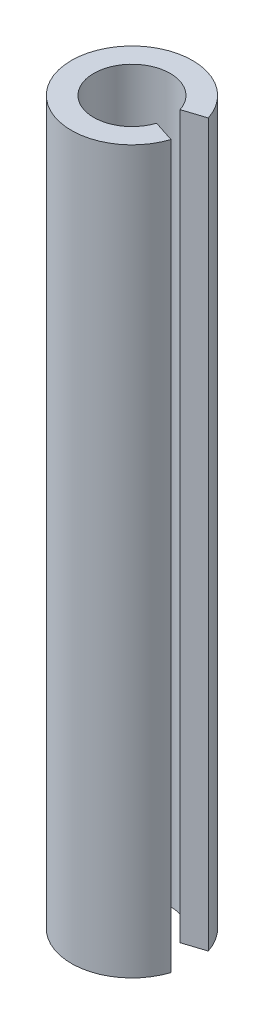
ISO-10303-21;
HEADER;
FILE_DESCRIPTION(('STEP AP214'),'2;1');
FILE_NAME('part.step','',(''),(''),'','','');
FILE_SCHEMA(('AUTOMOTIVE_DESIGN { 1 0 10303 214 1 1 1 1 }'));
ENDSEC;
DATA;
#1=APPLICATION_CONTEXT('core data for automotive mechanical design processes');
#2=APPLICATION_PROTOCOL_DEFINITION('international standard','automotive_design',2000,#1);
#3=PRODUCT_CONTEXT('',#1,'mechanical');
#4=PRODUCT('Part','Part','',(#3));
#5=PRODUCT_RELATED_PRODUCT_CATEGORY('part','',(#4));
#6=PRODUCT_DEFINITION_FORMATION('','',#4);
#7=PRODUCT_DEFINITION_CONTEXT('part definition',#1,'design');
#8=PRODUCT_DEFINITION('design','',#6,#7);
#9=PRODUCT_DEFINITION_SHAPE('','',#8);
#10=(LENGTH_UNIT() NAMED_UNIT(*) SI_UNIT(.MILLI.,.METRE.));
#11=(NAMED_UNIT(*) PLANE_ANGLE_UNIT() SI_UNIT($,.RADIAN.));
#12=(NAMED_UNIT(*) SI_UNIT($,.STERADIAN.) SOLID_ANGLE_UNIT());
#13=UNCERTAINTY_MEASURE_WITH_UNIT(LENGTH_MEASURE(1.E-05),#10,'distance_accuracy_value','');
#14=(GEOMETRIC_REPRESENTATION_CONTEXT(3) GLOBAL_UNCERTAINTY_ASSIGNED_CONTEXT((#13)) GLOBAL_UNIT_ASSIGNED_CONTEXT((#10,
#11,#12)) REPRESENTATION_CONTEXT('',''));
#15=CARTESIAN_POINT('',(0.,0.,0.));
#16=DIRECTION('',(0.,0.,1.));
#17=DIRECTION('',(1.,0.,0.));
#18=AXIS2_PLACEMENT_3D('',#15,#16,#17);
#19=CARTESIAN_POINT('',(0.,38.7,0.));
#20=DIRECTION('',(0.,-1.,0.));
#21=DIRECTION('',(0.,0.,-1.));
#22=AXIS2_PLACEMENT_3D('',#19,#20,#21);
#23=CYLINDRICAL_SURFACE('',#22,3.25);
#24=CARTESIAN_POINT('',(0.,0.,0.));
#25=DIRECTION('',(0.,1.,0.));
#26=DIRECTION('',(0.,0.,1.));
#27=AXIS2_PLACEMENT_3D('',#24,#25,#26);
#28=CIRCLE('',#27,3.25);
#29=CARTESIAN_POINT('',(3.09232921921324,0.,-1.));
#30=VERTEX_POINT('',#29);
#31=CARTESIAN_POINT('',(3.09232921921325,0.,0.999999999999999));
#32=VERTEX_POINT('',#31);
#33=EDGE_CURVE('E112',#30,#32,#28,.T.);
#34=ORIENTED_EDGE('',*,*,#33,.T.);
#35=DIRECTION('',(0.,-1.,0.));
#36=VECTOR('',#35,1.);
#37=CARTESIAN_POINT('',(3.09232921921325,38.7,0.999999999999999));
#38=LINE('',#37,#36);
#39=CARTESIAN_POINT('',(3.09232921921325,38.7,0.999999999999999));
#40=VERTEX_POINT('',#39);
#41=EDGE_CURVE('E13',#40,#32,#38,.T.);
#42=ORIENTED_EDGE('',*,*,#41,.F.);
#43=CARTESIAN_POINT('',(0.,38.7,0.));
#44=DIRECTION('',(0.,1.,0.));
#45=DIRECTION('',(0.,0.,1.));
#46=AXIS2_PLACEMENT_3D('',#43,#44,#45);
#47=CIRCLE('',#46,3.25);
#48=CARTESIAN_POINT('',(3.09232921921324,38.7,-1.));
#49=VERTEX_POINT('',#48);
#50=EDGE_CURVE('E89',#49,#40,#47,.T.);
#51=ORIENTED_EDGE('',*,*,#50,.F.);
#52=DIRECTION('',(0.,-1.,0.));
#53=VECTOR('',#52,1.);
#54=CARTESIAN_POINT('',(3.09232921921324,38.7,-1.));
#55=LINE('',#54,#53);
#56=EDGE_CURVE('E65',#49,#30,#55,.T.);
#57=ORIENTED_EDGE('',*,*,#56,.T.);
#58=EDGE_LOOP('',(#34,#42,#51,#57));
#59=FACE_BOUND('',#58,.T.);
#60=ADVANCED_FACE('F49',(#59),#23,.T.);
#61=CARTESIAN_POINT('',(1.95054612288835,38.7,0.630769230769231));
#62=DIRECTION('',(0.307692307692307,0.,-0.951485913604076));
#63=DIRECTION('',(-0.951485913604076,0.,-0.307692307692307));
#64=AXIS2_PLACEMENT_3D('',#61,#62,#63);
#65=PLANE('',#64);
#66=DIRECTION('',(0.951485913604076,0.,0.307692307692307));
#67=VECTOR('',#66,1.);
#68=CARTESIAN_POINT('',(1.95054612288835,0.,0.630769230769231));
#69=LINE('',#68,#67);
#70=CARTESIAN_POINT('',(1.95054612288835,0.,0.630769230769231));
#71=VERTEX_POINT('',#70);
#72=EDGE_CURVE('E98',#71,#32,#69,.T.);
#73=ORIENTED_EDGE('',*,*,#72,.F.);
#74=DIRECTION('',(0.,-1.,0.));
#75=VECTOR('',#74,1.);
#76=CARTESIAN_POINT('',(1.95054612288835,38.7,0.630769230769231));
#77=LINE('',#76,#75);
#78=CARTESIAN_POINT('',(1.95054612288835,38.7,0.630769230769231));
#79=VERTEX_POINT('',#78);
#80=EDGE_CURVE('E57',#79,#71,#77,.T.);
#81=ORIENTED_EDGE('',*,*,#80,.F.);
#82=DIRECTION('',(0.951485913604076,0.,0.307692307692307));
#83=VECTOR('',#82,1.);
#84=CARTESIAN_POINT('',(1.95054612288835,38.7,0.630769230769231));
#85=LINE('',#84,#83);
#86=EDGE_CURVE('E96',#79,#40,#85,.T.);
#87=ORIENTED_EDGE('',*,*,#86,.T.);
#88=ORIENTED_EDGE('',*,*,#41,.T.);
#89=EDGE_LOOP('',(#73,#81,#87,#88));
#90=FACE_BOUND('',#89,.T.);
#91=ADVANCED_FACE('F95',(#90),#65,.T.);
#92=CARTESIAN_POINT('',(0.,38.7,0.));
#93=DIRECTION('',(0.,-1.,0.));
#94=DIRECTION('',(0.,0.,-1.));
#95=AXIS2_PLACEMENT_3D('',#92,#93,#94);
#96=CYLINDRICAL_SURFACE('',#95,2.05);
#97=CARTESIAN_POINT('',(0.,0.,0.));
#98=DIRECTION('',(0.,1.,0.));
#99=DIRECTION('',(1.,0.,0.));
#100=AXIS2_PLACEMENT_3D('',#97,#98,#99);
#101=CIRCLE('',#100,2.05);
#102=CARTESIAN_POINT('',(1.95054612288835,0.,-0.630769230769231));
#103=VERTEX_POINT('',#102);
#104=EDGE_CURVE('E115',#103,#71,#101,.T.);
#105=ORIENTED_EDGE('',*,*,#104,.F.);
#106=DIRECTION('',(0.,-1.,0.));
#107=VECTOR('',#106,1.);
#108=CARTESIAN_POINT('',(1.95054612288835,38.7,-0.630769230769231));
#109=LINE('',#108,#107);
#110=CARTESIAN_POINT('',(1.95054612288835,38.7,-0.630769230769231));
#111=VERTEX_POINT('',#110);
#112=EDGE_CURVE('E78',#111,#103,#109,.T.);
#113=ORIENTED_EDGE('',*,*,#112,.F.);
#114=CARTESIAN_POINT('',(0.,38.7,0.));
#115=DIRECTION('',(0.,1.,0.));
#116=DIRECTION('',(1.,0.,0.));
#117=AXIS2_PLACEMENT_3D('',#114,#115,#116);
#118=CIRCLE('',#117,2.05);
#119=EDGE_CURVE('E104',#111,#79,#118,.T.);
#120=ORIENTED_EDGE('',*,*,#119,.T.);
#121=ORIENTED_EDGE('',*,*,#80,.T.);
#122=EDGE_LOOP('',(#105,#113,#120,#121));
#123=FACE_BOUND('',#122,.T.);
#124=ADVANCED_FACE('F106',(#123),#96,.F.);
#125=CARTESIAN_POINT('',(3.09232921921324,38.7,-1.));
#126=DIRECTION('',(0.307692307692308,0.,0.951485913604076));
#127=DIRECTION('',(0.951485913604076,0.,-0.307692307692308));
#128=AXIS2_PLACEMENT_3D('',#125,#126,#127);
#129=PLANE('',#128);
#130=DIRECTION('',(-0.951485913604076,0.,0.307692307692308));
#131=VECTOR('',#130,1.);
#132=CARTESIAN_POINT('',(3.09232921921324,0.,-1.));
#133=LINE('',#132,#131);
#134=EDGE_CURVE('E117',#30,#103,#133,.T.);
#135=ORIENTED_EDGE('',*,*,#134,.F.);
#136=ORIENTED_EDGE('',*,*,#56,.F.);
#137=DIRECTION('',(-0.951485913604076,0.,0.307692307692308));
#138=VECTOR('',#137,1.);
#139=CARTESIAN_POINT('',(3.09232921921324,38.7,-1.));
#140=LINE('',#139,#138);
#141=EDGE_CURVE('E107',#49,#111,#140,.T.);
#142=ORIENTED_EDGE('',*,*,#141,.T.);
#143=ORIENTED_EDGE('',*,*,#112,.T.);
#144=EDGE_LOOP('',(#135,#136,#142,#143));
#145=FACE_BOUND('',#144,.T.);
#146=ADVANCED_FACE('F123',(#145),#129,.T.);
#147=CARTESIAN_POINT('',(0.,38.7,0.));
#148=DIRECTION('',(0.,1.,0.));
#149=DIRECTION('',(1.,0.,0.));
#150=AXIS2_PLACEMENT_3D('',#147,#148,#149);
#151=PLANE('',#150);
#152=ORIENTED_EDGE('',*,*,#50,.T.);
#153=ORIENTED_EDGE('',*,*,#86,.F.);
#154=ORIENTED_EDGE('',*,*,#119,.F.);
#155=ORIENTED_EDGE('',*,*,#141,.F.);
#156=EDGE_LOOP('',(#152,#153,#154,#155));
#157=FACE_BOUND('',#156,.T.);
#158=ADVANCED_FACE('F103',(#157),#151,.T.);
#159=CARTESIAN_POINT('',(0.,0.,0.));
#160=DIRECTION('',(0.,1.,0.));
#161=DIRECTION('',(1.,0.,0.));
#162=AXIS2_PLACEMENT_3D('',#159,#160,#161);
#163=PLANE('',#162);
#164=ORIENTED_EDGE('',*,*,#33,.F.);
#165=ORIENTED_EDGE('',*,*,#134,.T.);
#166=ORIENTED_EDGE('',*,*,#104,.T.);
#167=ORIENTED_EDGE('',*,*,#72,.T.);
#168=EDGE_LOOP('',(#164,#165,#166,#167));
#169=FACE_BOUND('',#168,.T.);
#170=ADVANCED_FACE('F122',(#169),#163,.F.);
#171=CLOSED_SHELL('',(#60,#91,#124,#146,#158,#170));
#172=MANIFOLD_SOLID_BREP('B2',#171);
#173=ADVANCED_BREP_SHAPE_REPRESENTATION('',(#18,#172),#14);
#174=SHAPE_DEFINITION_REPRESENTATION(#9,#173);
ENDSEC;
END-ISO-10303-21;
